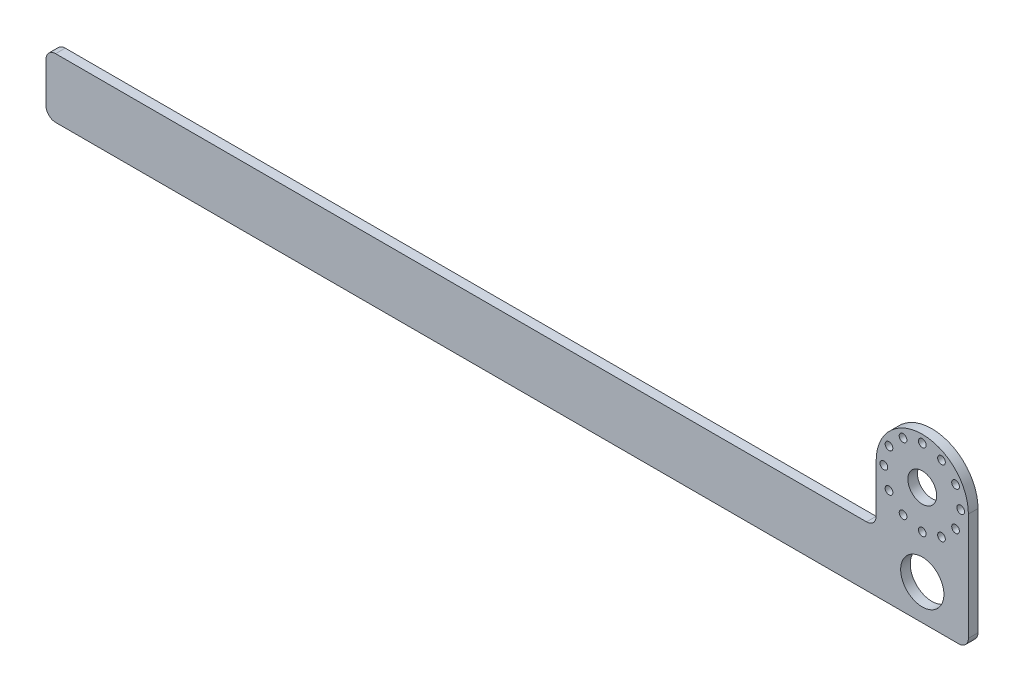
ISO-10303-21;
HEADER;
FILE_DESCRIPTION(('STEP AP214'),'2;1');
FILE_NAME('part.step','',(''),(''),'','','');
FILE_SCHEMA(('AUTOMOTIVE_DESIGN { 1 0 10303 214 1 1 1 1 }'));
ENDSEC;
DATA;
#1=APPLICATION_CONTEXT('core data for automotive mechanical design processes');
#2=APPLICATION_PROTOCOL_DEFINITION('international standard','automotive_design',2000,#1);
#3=PRODUCT_CONTEXT('',#1,'mechanical');
#4=PRODUCT('Part','Part','',(#3));
#5=PRODUCT_RELATED_PRODUCT_CATEGORY('part','',(#4));
#6=PRODUCT_DEFINITION_FORMATION('','',#4);
#7=PRODUCT_DEFINITION_CONTEXT('part definition',#1,'design');
#8=PRODUCT_DEFINITION('design','',#6,#7);
#9=PRODUCT_DEFINITION_SHAPE('','',#8);
#10=(LENGTH_UNIT() NAMED_UNIT(*) SI_UNIT(.MILLI.,.METRE.));
#11=(NAMED_UNIT(*) PLANE_ANGLE_UNIT() SI_UNIT($,.RADIAN.));
#12=(NAMED_UNIT(*) SI_UNIT($,.STERADIAN.) SOLID_ANGLE_UNIT());
#13=UNCERTAINTY_MEASURE_WITH_UNIT(LENGTH_MEASURE(1.E-05),#10,'distance_accuracy_value','');
#14=(GEOMETRIC_REPRESENTATION_CONTEXT(3) GLOBAL_UNCERTAINTY_ASSIGNED_CONTEXT((#13)) GLOBAL_UNIT_ASSIGNED_CONTEXT((#10,
#11,#12)) REPRESENTATION_CONTEXT('',''));
#15=CARTESIAN_POINT('',(0.,0.,0.));
#16=DIRECTION('',(0.,0.,1.));
#17=DIRECTION('',(1.,0.,0.));
#18=AXIS2_PLACEMENT_3D('',#15,#16,#17);
#19=CARTESIAN_POINT('',(609.6,0.,6.35));
#20=DIRECTION('',(1.,0.,0.));
#21=DIRECTION('',(0.,0.,-1.));
#22=AXIS2_PLACEMENT_3D('',#19,#20,#21);
#23=PLANE('',#22);
#24=DIRECTION('',(0.,-1.,0.));
#25=VECTOR('',#24,1.);
#26=CARTESIAN_POINT('',(609.6,0.,6.35));
#27=LINE('',#26,#25);
#28=CARTESIAN_POINT('',(609.6,77.47,6.35));
#29=VERTEX_POINT('',#28);
#30=CARTESIAN_POINT('',(609.6,6.35,6.35));
#31=VERTEX_POINT('',#30);
#32=EDGE_CURVE('E129',#29,#31,#27,.T.);
#33=ORIENTED_EDGE('',*,*,#32,.T.);
#34=DIRECTION('',(0.,0.,-1.));
#35=VECTOR('',#34,1.);
#36=CARTESIAN_POINT('',(609.6,6.35,0.));
#37=LINE('',#36,#35);
#38=CARTESIAN_POINT('',(609.6,6.35,0.));
#39=VERTEX_POINT('',#38);
#40=EDGE_CURVE('E293',#31,#39,#37,.T.);
#41=ORIENTED_EDGE('',*,*,#40,.T.);
#42=DIRECTION('',(0.,-1.,0.));
#43=VECTOR('',#42,1.);
#44=CARTESIAN_POINT('',(609.6,0.,0.));
#45=LINE('',#44,#43);
#46=CARTESIAN_POINT('',(609.6,77.47,0.));
#47=VERTEX_POINT('',#46);
#48=EDGE_CURVE('E132',#47,#39,#45,.T.);
#49=ORIENTED_EDGE('',*,*,#48,.F.);
#50=DIRECTION('',(0.,0.,-1.));
#51=VECTOR('',#50,1.);
#52=CARTESIAN_POINT('',(609.6,77.47,6.35));
#53=LINE('',#52,#51);
#54=EDGE_CURVE('E125',#29,#47,#53,.T.);
#55=ORIENTED_EDGE('',*,*,#54,.F.);
#56=EDGE_LOOP('',(#33,#41,#49,#55));
#57=FACE_BOUND('',#56,.T.);
#58=ADVANCED_FACE('F47',(#57),#23,.T.);
#59=CARTESIAN_POINT('',(579.12,77.47,6.35));
#60=DIRECTION('',(0.,0.,-1.));
#61=DIRECTION('',(-1.,0.,0.));
#62=AXIS2_PLACEMENT_3D('',#59,#60,#61);
#63=CYLINDRICAL_SURFACE('',#62,30.48);
#64=CARTESIAN_POINT('',(579.12,77.47,0.));
#65=DIRECTION('',(0.,0.,1.));
#66=DIRECTION('',(1.,0.,0.));
#67=AXIS2_PLACEMENT_3D('',#64,#65,#66);
#68=CIRCLE('',#67,30.48);
#69=CARTESIAN_POINT('',(548.64,77.47,0.));
#70=VERTEX_POINT('',#69);
#71=EDGE_CURVE('E232',#47,#70,#68,.T.);
#72=ORIENTED_EDGE('',*,*,#71,.T.);
#73=DIRECTION('',(0.,0.,-1.));
#74=VECTOR('',#73,1.);
#75=CARTESIAN_POINT('',(548.64,77.47,6.35));
#76=LINE('',#75,#74);
#77=CARTESIAN_POINT('',(548.64,77.47,6.35));
#78=VERTEX_POINT('',#77);
#79=EDGE_CURVE('E138',#78,#70,#76,.T.);
#80=ORIENTED_EDGE('',*,*,#79,.F.);
#81=CARTESIAN_POINT('',(579.12,77.47,6.35));
#82=DIRECTION('',(0.,0.,1.));
#83=DIRECTION('',(1.,0.,0.));
#84=AXIS2_PLACEMENT_3D('',#81,#82,#83);
#85=CIRCLE('',#84,30.48);
#86=EDGE_CURVE('E142',#29,#78,#85,.T.);
#87=ORIENTED_EDGE('',*,*,#86,.F.);
#88=ORIENTED_EDGE('',*,*,#54,.T.);
#89=EDGE_LOOP('',(#72,#80,#87,#88));
#90=FACE_BOUND('',#89,.T.);
#91=ADVANCED_FACE('F143',(#90),#63,.T.);
#92=CARTESIAN_POINT('',(548.64,0.,6.35));
#93=DIRECTION('',(1.,0.,0.));
#94=DIRECTION('',(0.,0.,-1.));
#95=AXIS2_PLACEMENT_3D('',#92,#93,#94);
#96=PLANE('',#95);
#97=DIRECTION('',(0.,-1.,0.));
#98=VECTOR('',#97,1.);
#99=CARTESIAN_POINT('',(548.64,0.,0.));
#100=LINE('',#99,#98);
#101=CARTESIAN_POINT('',(548.64,45.72,0.));
#102=VERTEX_POINT('',#101);
#103=EDGE_CURVE('E235',#70,#102,#100,.T.);
#104=ORIENTED_EDGE('',*,*,#103,.T.);
#105=DIRECTION('',(0.,0.,-1.));
#106=VECTOR('',#105,1.);
#107=CARTESIAN_POINT('',(548.64,45.72,6.35));
#108=LINE('',#107,#106);
#109=CARTESIAN_POINT('',(548.64,45.72,6.35));
#110=VERTEX_POINT('',#109);
#111=EDGE_CURVE('E290',#102,#110,#108,.F.);
#112=ORIENTED_EDGE('',*,*,#111,.T.);
#113=DIRECTION('',(0.,-1.,0.));
#114=VECTOR('',#113,1.);
#115=CARTESIAN_POINT('',(548.64,0.,6.35));
#116=LINE('',#115,#114);
#117=EDGE_CURVE('E146',#78,#110,#116,.T.);
#118=ORIENTED_EDGE('',*,*,#117,.F.);
#119=ORIENTED_EDGE('',*,*,#79,.T.);
#120=EDGE_LOOP('',(#104,#112,#118,#119));
#121=FACE_BOUND('',#120,.T.);
#122=ADVANCED_FACE('F303',(#121),#96,.F.);
#123=CARTESIAN_POINT('',(0.,39.37,6.35));
#124=DIRECTION('',(0.,1.,0.));
#125=DIRECTION('',(0.,0.,1.));
#126=AXIS2_PLACEMENT_3D('',#123,#124,#125);
#127=PLANE('',#126);
#128=DIRECTION('',(1.,0.,0.));
#129=VECTOR('',#128,1.);
#130=CARTESIAN_POINT('',(0.,39.37,6.35));
#131=LINE('',#130,#129);
#132=CARTESIAN_POINT('',(6.35,39.37,6.35));
#133=VERTEX_POINT('',#132);
#134=CARTESIAN_POINT('',(542.29,39.37,6.35));
#135=VERTEX_POINT('',#134);
#136=EDGE_CURVE('E164',#133,#135,#131,.T.);
#137=ORIENTED_EDGE('',*,*,#136,.T.);
#138=DIRECTION('',(0.,0.,-1.));
#139=VECTOR('',#138,1.);
#140=CARTESIAN_POINT('',(542.29,39.37,6.35));
#141=LINE('',#140,#139);
#142=CARTESIAN_POINT('',(542.29,39.37,0.));
#143=VERTEX_POINT('',#142);
#144=EDGE_CURVE('E286',#135,#143,#141,.T.);
#145=ORIENTED_EDGE('',*,*,#144,.T.);
#146=DIRECTION('',(1.,0.,0.));
#147=VECTOR('',#146,1.);
#148=CARTESIAN_POINT('',(0.,39.37,0.));
#149=LINE('',#148,#147);
#150=CARTESIAN_POINT('',(6.35,39.37,0.));
#151=VERTEX_POINT('',#150);
#152=EDGE_CURVE('E239',#151,#143,#149,.T.);
#153=ORIENTED_EDGE('',*,*,#152,.F.);
#154=DIRECTION('',(0.,0.,-1.));
#155=VECTOR('',#154,1.);
#156=CARTESIAN_POINT('',(6.35,39.37,6.35));
#157=LINE('',#156,#155);
#158=EDGE_CURVE('E68',#151,#133,#157,.F.);
#159=ORIENTED_EDGE('',*,*,#158,.T.);
#160=EDGE_LOOP('',(#137,#145,#153,#159));
#161=FACE_BOUND('',#160,.T.);
#162=ADVANCED_FACE('F305',(#161),#127,.T.);
#163=CARTESIAN_POINT('',(0.,0.,6.35));
#164=DIRECTION('',(-1.,0.,0.));
#165=DIRECTION('',(0.,0.,1.));
#166=AXIS2_PLACEMENT_3D('',#163,#164,#165);
#167=PLANE('',#166);
#168=DIRECTION('',(0.,1.,0.));
#169=VECTOR('',#168,1.);
#170=CARTESIAN_POINT('',(0.,0.,0.));
#171=LINE('',#170,#169);
#172=CARTESIAN_POINT('',(0.,6.35,0.));
#173=VERTEX_POINT('',#172);
#174=CARTESIAN_POINT('',(0.,33.02,0.));
#175=VERTEX_POINT('',#174);
#176=EDGE_CURVE('E243',#173,#175,#171,.T.);
#177=ORIENTED_EDGE('',*,*,#176,.F.);
#178=DIRECTION('',(0.,0.,-1.));
#179=VECTOR('',#178,1.);
#180=CARTESIAN_POINT('',(0.,6.35,6.35));
#181=LINE('',#180,#179);
#182=CARTESIAN_POINT('',(0.,6.35,6.35));
#183=VERTEX_POINT('',#182);
#184=EDGE_CURVE('E273',#173,#183,#181,.F.);
#185=ORIENTED_EDGE('',*,*,#184,.T.);
#186=DIRECTION('',(0.,1.,0.));
#187=VECTOR('',#186,1.);
#188=CARTESIAN_POINT('',(0.,0.,6.35));
#189=LINE('',#188,#187);
#190=CARTESIAN_POINT('',(0.,33.02,6.35));
#191=VERTEX_POINT('',#190);
#192=EDGE_CURVE('E167',#183,#191,#189,.T.);
#193=ORIENTED_EDGE('',*,*,#192,.T.);
#194=DIRECTION('',(0.,0.,-1.));
#195=VECTOR('',#194,1.);
#196=CARTESIAN_POINT('',(0.,33.02,6.35));
#197=LINE('',#196,#195);
#198=EDGE_CURVE('E269',#191,#175,#197,.T.);
#199=ORIENTED_EDGE('',*,*,#198,.T.);
#200=EDGE_LOOP('',(#177,#185,#193,#199));
#201=FACE_BOUND('',#200,.T.);
#202=ADVANCED_FACE('F312',(#201),#167,.T.);
#203=CARTESIAN_POINT('',(566.42,99.4670452561247,6.35));
#204=DIRECTION('',(0.,0.,-1.));
#205=DIRECTION('',(-1.,0.,0.));
#206=AXIS2_PLACEMENT_3D('',#203,#204,#205);
#207=CYLINDRICAL_SURFACE('',#206,2.53999999999995);
#208=CARTESIAN_POINT('',(566.42,99.4670452561247,6.35));
#209=DIRECTION('',(0.,0.,1.));
#210=DIRECTION('',(1.,0.,0.));
#211=AXIS2_PLACEMENT_3D('',#208,#209,#210);
#212=CIRCLE('',#211,2.53999999999995);
#213=CARTESIAN_POINT('',(568.96,99.4670452561247,6.35));
#214=VERTEX_POINT('',#213);
#215=EDGE_CURVE('E154',#214,#214,#212,.T.);
#216=ORIENTED_EDGE('',*,*,#215,.T.);
#217=EDGE_LOOP('',(#216));
#218=FACE_BOUND('',#217,.T.);
#219=CARTESIAN_POINT('',(566.42,99.4670452561247,0.));
#220=DIRECTION('',(0.,0.,1.));
#221=DIRECTION('',(1.,0.,0.));
#222=AXIS2_PLACEMENT_3D('',#219,#220,#221);
#223=CIRCLE('',#222,2.53999999999995);
#224=CARTESIAN_POINT('',(568.96,99.4670452561247,0.));
#225=VERTEX_POINT('',#224);
#226=EDGE_CURVE('E226',#225,#225,#223,.T.);
#227=ORIENTED_EDGE('',*,*,#226,.F.);
#228=EDGE_LOOP('',(#227));
#229=FACE_BOUND('',#228,.T.);
#230=ADVANCED_FACE('F337',(#218,#229),#207,.F.);
#231=CARTESIAN_POINT('',(557.122954743875,90.17,6.35));
#232=DIRECTION('',(0.,0.,-1.));
#233=DIRECTION('',(-1.,0.,0.));
#234=AXIS2_PLACEMENT_3D('',#231,#232,#233);
#235=CYLINDRICAL_SURFACE('',#234,2.53999999999995);
#236=CARTESIAN_POINT('',(557.122954743875,90.17,6.35));
#237=DIRECTION('',(0.,0.,1.));
#238=DIRECTION('',(1.,0.,0.));
#239=AXIS2_PLACEMENT_3D('',#236,#237,#238);
#240=CIRCLE('',#239,2.53999999999995);
#241=CARTESIAN_POINT('',(559.662954743875,90.17,6.35));
#242=VERTEX_POINT('',#241);
#243=EDGE_CURVE('E158',#242,#242,#240,.T.);
#244=ORIENTED_EDGE('',*,*,#243,.T.);
#245=EDGE_LOOP('',(#244));
#246=FACE_BOUND('',#245,.T.);
#247=CARTESIAN_POINT('',(557.122954743875,90.17,0.));
#248=DIRECTION('',(0.,0.,1.));
#249=DIRECTION('',(1.,0.,0.));
#250=AXIS2_PLACEMENT_3D('',#247,#248,#249);
#251=CIRCLE('',#250,2.53999999999995);
#252=CARTESIAN_POINT('',(559.662954743875,90.17,0.));
#253=VERTEX_POINT('',#252);
#254=EDGE_CURVE('E222',#253,#253,#251,.T.);
#255=ORIENTED_EDGE('',*,*,#254,.F.);
#256=EDGE_LOOP('',(#255));
#257=FACE_BOUND('',#256,.T.);
#258=ADVANCED_FACE('F340',(#246,#257),#235,.F.);
#259=CARTESIAN_POINT('',(553.72,77.47,6.35));
#260=DIRECTION('',(0.,0.,-1.));
#261=DIRECTION('',(-1.,0.,0.));
#262=AXIS2_PLACEMENT_3D('',#259,#260,#261);
#263=CYLINDRICAL_SURFACE('',#262,2.53999999999995);
#264=CARTESIAN_POINT('',(553.72,77.47,6.35));
#265=DIRECTION('',(0.,0.,1.));
#266=DIRECTION('',(1.,0.,0.));
#267=AXIS2_PLACEMENT_3D('',#264,#265,#266);
#268=CIRCLE('',#267,2.53999999999995);
#269=CARTESIAN_POINT('',(556.26,77.47,6.35));
#270=VERTEX_POINT('',#269);
#271=EDGE_CURVE('E608',#270,#270,#268,.T.);
#272=ORIENTED_EDGE('',*,*,#271,.T.);
#273=EDGE_LOOP('',(#272));
#274=FACE_BOUND('',#273,.T.);
#275=CARTESIAN_POINT('',(553.72,77.47,0.));
#276=DIRECTION('',(0.,0.,1.));
#277=DIRECTION('',(1.,0.,0.));
#278=AXIS2_PLACEMENT_3D('',#275,#276,#277);
#279=CIRCLE('',#278,2.53999999999995);
#280=CARTESIAN_POINT('',(556.26,77.47,0.));
#281=VERTEX_POINT('',#280);
#282=EDGE_CURVE('E218',#281,#281,#279,.T.);
#283=ORIENTED_EDGE('',*,*,#282,.F.);
#284=EDGE_LOOP('',(#283));
#285=FACE_BOUND('',#284,.T.);
#286=ADVANCED_FACE('F344',(#274,#285),#263,.F.);
#287=CARTESIAN_POINT('',(557.122954743875,64.7699999999999,6.35));
#288=DIRECTION('',(0.,0.,-1.));
#289=DIRECTION('',(-1.,0.,0.));
#290=AXIS2_PLACEMENT_3D('',#287,#288,#289);
#291=CYLINDRICAL_SURFACE('',#290,2.53999999999995);
#292=CARTESIAN_POINT('',(557.122954743875,64.7699999999999,6.35));
#293=DIRECTION('',(0.,0.,1.));
#294=DIRECTION('',(1.,0.,0.));
#295=AXIS2_PLACEMENT_3D('',#292,#293,#294);
#296=CIRCLE('',#295,2.53999999999995);
#297=CARTESIAN_POINT('',(559.662954743875,64.7699999999999,6.35));
#298=VERTEX_POINT('',#297);
#299=EDGE_CURVE('E604',#298,#298,#296,.T.);
#300=ORIENTED_EDGE('',*,*,#299,.T.);
#301=EDGE_LOOP('',(#300));
#302=FACE_BOUND('',#301,.T.);
#303=CARTESIAN_POINT('',(557.122954743875,64.7699999999999,0.));
#304=DIRECTION('',(0.,0.,1.));
#305=DIRECTION('',(1.,0.,0.));
#306=AXIS2_PLACEMENT_3D('',#303,#304,#305);
#307=CIRCLE('',#306,2.53999999999995);
#308=CARTESIAN_POINT('',(559.662954743875,64.7699999999999,0.));
#309=VERTEX_POINT('',#308);
#310=EDGE_CURVE('E214',#309,#309,#307,.T.);
#311=ORIENTED_EDGE('',*,*,#310,.F.);
#312=EDGE_LOOP('',(#311));
#313=FACE_BOUND('',#312,.T.);
#314=ADVANCED_FACE('F348',(#302,#313),#291,.F.);
#315=CARTESIAN_POINT('',(566.42,55.4729547438752,6.35));
#316=DIRECTION('',(0.,0.,-1.));
#317=DIRECTION('',(-1.,0.,0.));
#318=AXIS2_PLACEMENT_3D('',#315,#316,#317);
#319=CYLINDRICAL_SURFACE('',#318,2.54000000000007);
#320=CARTESIAN_POINT('',(566.42,55.4729547438752,6.35));
#321=DIRECTION('',(0.,0.,1.));
#322=DIRECTION('',(1.,0.,0.));
#323=AXIS2_PLACEMENT_3D('',#320,#321,#322);
#324=CIRCLE('',#323,2.54000000000007);
#325=CARTESIAN_POINT('',(568.96,55.4729547438752,6.35));
#326=VERTEX_POINT('',#325);
#327=EDGE_CURVE('E600',#326,#326,#324,.T.);
#328=ORIENTED_EDGE('',*,*,#327,.T.);
#329=EDGE_LOOP('',(#328));
#330=FACE_BOUND('',#329,.T.);
#331=CARTESIAN_POINT('',(566.42,55.4729547438752,0.));
#332=DIRECTION('',(0.,0.,1.));
#333=DIRECTION('',(1.,0.,0.));
#334=AXIS2_PLACEMENT_3D('',#331,#332,#333);
#335=CIRCLE('',#334,2.54000000000007);
#336=CARTESIAN_POINT('',(568.96,55.4729547438752,0.));
#337=VERTEX_POINT('',#336);
#338=EDGE_CURVE('E210',#337,#337,#335,.T.);
#339=ORIENTED_EDGE('',*,*,#338,.F.);
#340=EDGE_LOOP('',(#339));
#341=FACE_BOUND('',#340,.T.);
#342=ADVANCED_FACE('F352',(#330,#341),#319,.F.);
#343=CARTESIAN_POINT('',(579.12,52.07,6.35));
#344=DIRECTION('',(0.,0.,-1.));
#345=DIRECTION('',(-1.,0.,0.));
#346=AXIS2_PLACEMENT_3D('',#343,#344,#345);
#347=CYLINDRICAL_SURFACE('',#346,2.53999999999995);
#348=CARTESIAN_POINT('',(579.12,52.07,6.35));
#349=DIRECTION('',(0.,0.,1.));
#350=DIRECTION('',(1.,0.,0.));
#351=AXIS2_PLACEMENT_3D('',#348,#349,#350);
#352=CIRCLE('',#351,2.53999999999995);
#353=CARTESIAN_POINT('',(581.66,52.07,6.35));
#354=VERTEX_POINT('',#353);
#355=EDGE_CURVE('E596',#354,#354,#352,.T.);
#356=ORIENTED_EDGE('',*,*,#355,.T.);
#357=EDGE_LOOP('',(#356));
#358=FACE_BOUND('',#357,.T.);
#359=CARTESIAN_POINT('',(579.12,52.07,0.));
#360=DIRECTION('',(0.,0.,1.));
#361=DIRECTION('',(1.,0.,0.));
#362=AXIS2_PLACEMENT_3D('',#359,#360,#361);
#363=CIRCLE('',#362,2.53999999999995);
#364=CARTESIAN_POINT('',(581.66,52.07,0.));
#365=VERTEX_POINT('',#364);
#366=EDGE_CURVE('E206',#365,#365,#363,.T.);
#367=ORIENTED_EDGE('',*,*,#366,.F.);
#368=EDGE_LOOP('',(#367));
#369=FACE_BOUND('',#368,.T.);
#370=ADVANCED_FACE('F356',(#358,#369),#347,.F.);
#371=CARTESIAN_POINT('',(591.82,55.4729547438753,6.35));
#372=DIRECTION('',(0.,0.,-1.));
#373=DIRECTION('',(-1.,0.,0.));
#374=AXIS2_PLACEMENT_3D('',#371,#372,#373);
#375=CYLINDRICAL_SURFACE('',#374,2.53999999999995);
#376=CARTESIAN_POINT('',(591.82,55.4729547438753,6.35));
#377=DIRECTION('',(0.,0.,1.));
#378=DIRECTION('',(1.,0.,0.));
#379=AXIS2_PLACEMENT_3D('',#376,#377,#378);
#380=CIRCLE('',#379,2.53999999999995);
#381=CARTESIAN_POINT('',(594.36,55.4729547438753,6.35));
#382=VERTEX_POINT('',#381);
#383=EDGE_CURVE('E592',#382,#382,#380,.T.);
#384=ORIENTED_EDGE('',*,*,#383,.T.);
#385=EDGE_LOOP('',(#384));
#386=FACE_BOUND('',#385,.T.);
#387=CARTESIAN_POINT('',(591.82,55.4729547438753,0.));
#388=DIRECTION('',(0.,0.,1.));
#389=DIRECTION('',(1.,0.,0.));
#390=AXIS2_PLACEMENT_3D('',#387,#388,#389);
#391=CIRCLE('',#390,2.53999999999995);
#392=CARTESIAN_POINT('',(594.36,55.4729547438753,0.));
#393=VERTEX_POINT('',#392);
#394=EDGE_CURVE('E202',#393,#393,#391,.T.);
#395=ORIENTED_EDGE('',*,*,#394,.F.);
#396=EDGE_LOOP('',(#395));
#397=FACE_BOUND('',#396,.T.);
#398=ADVANCED_FACE('F360',(#386,#397),#375,.F.);
#399=CARTESIAN_POINT('',(601.117045256125,64.7700000000001,6.35));
#400=DIRECTION('',(0.,0.,-1.));
#401=DIRECTION('',(-1.,0.,0.));
#402=AXIS2_PLACEMENT_3D('',#399,#400,#401);
#403=CYLINDRICAL_SURFACE('',#402,2.53999999999995);
#404=CARTESIAN_POINT('',(601.117045256125,64.7700000000001,6.35));
#405=DIRECTION('',(0.,0.,1.));
#406=DIRECTION('',(1.,0.,0.));
#407=AXIS2_PLACEMENT_3D('',#404,#405,#406);
#408=CIRCLE('',#407,2.53999999999995);
#409=CARTESIAN_POINT('',(603.657045256125,64.7700000000001,6.35));
#410=VERTEX_POINT('',#409);
#411=EDGE_CURVE('E588',#410,#410,#408,.T.);
#412=ORIENTED_EDGE('',*,*,#411,.T.);
#413=EDGE_LOOP('',(#412));
#414=FACE_BOUND('',#413,.T.);
#415=CARTESIAN_POINT('',(601.117045256125,64.7700000000001,0.));
#416=DIRECTION('',(0.,0.,1.));
#417=DIRECTION('',(1.,0.,0.));
#418=AXIS2_PLACEMENT_3D('',#415,#416,#417);
#419=CIRCLE('',#418,2.53999999999995);
#420=CARTESIAN_POINT('',(603.657045256125,64.7700000000001,0.));
#421=VERTEX_POINT('',#420);
#422=EDGE_CURVE('E198',#421,#421,#419,.T.);
#423=ORIENTED_EDGE('',*,*,#422,.F.);
#424=EDGE_LOOP('',(#423));
#425=FACE_BOUND('',#424,.T.);
#426=ADVANCED_FACE('F364',(#414,#425),#403,.F.);
#427=CARTESIAN_POINT('',(604.52,77.4699999999999,6.35));
#428=DIRECTION('',(0.,0.,-1.));
#429=DIRECTION('',(-1.,0.,0.));
#430=AXIS2_PLACEMENT_3D('',#427,#428,#429);
#431=CYLINDRICAL_SURFACE('',#430,2.53999999999995);
#432=CARTESIAN_POINT('',(604.52,77.4699999999999,6.35));
#433=DIRECTION('',(0.,0.,1.));
#434=DIRECTION('',(1.,0.,0.));
#435=AXIS2_PLACEMENT_3D('',#432,#433,#434);
#436=CIRCLE('',#435,2.53999999999995);
#437=CARTESIAN_POINT('',(607.06,77.4699999999999,6.35));
#438=VERTEX_POINT('',#437);
#439=EDGE_CURVE('E584',#438,#438,#436,.T.);
#440=ORIENTED_EDGE('',*,*,#439,.T.);
#441=EDGE_LOOP('',(#440));
#442=FACE_BOUND('',#441,.T.);
#443=CARTESIAN_POINT('',(604.52,77.4699999999999,0.));
#444=DIRECTION('',(0.,0.,1.));
#445=DIRECTION('',(1.,0.,0.));
#446=AXIS2_PLACEMENT_3D('',#443,#444,#445);
#447=CIRCLE('',#446,2.53999999999995);
#448=CARTESIAN_POINT('',(607.06,77.4699999999999,0.));
#449=VERTEX_POINT('',#448);
#450=EDGE_CURVE('E194',#449,#449,#447,.T.);
#451=ORIENTED_EDGE('',*,*,#450,.F.);
#452=EDGE_LOOP('',(#451));
#453=FACE_BOUND('',#452,.T.);
#454=ADVANCED_FACE('F368',(#442,#453),#431,.F.);
#455=CARTESIAN_POINT('',(601.117045256125,90.17,6.35));
#456=DIRECTION('',(0.,0.,-1.));
#457=DIRECTION('',(-1.,0.,0.));
#458=AXIS2_PLACEMENT_3D('',#455,#456,#457);
#459=CYLINDRICAL_SURFACE('',#458,2.53999999999995);
#460=CARTESIAN_POINT('',(601.117045256125,90.17,6.35));
#461=DIRECTION('',(0.,0.,1.));
#462=DIRECTION('',(1.,0.,0.));
#463=AXIS2_PLACEMENT_3D('',#460,#461,#462);
#464=CIRCLE('',#463,2.53999999999995);
#465=CARTESIAN_POINT('',(603.657045256125,90.17,6.35));
#466=VERTEX_POINT('',#465);
#467=EDGE_CURVE('E580',#466,#466,#464,.T.);
#468=ORIENTED_EDGE('',*,*,#467,.T.);
#469=EDGE_LOOP('',(#468));
#470=FACE_BOUND('',#469,.T.);
#471=CARTESIAN_POINT('',(601.117045256125,90.17,0.));
#472=DIRECTION('',(0.,0.,1.));
#473=DIRECTION('',(1.,0.,0.));
#474=AXIS2_PLACEMENT_3D('',#471,#472,#473);
#475=CIRCLE('',#474,2.53999999999995);
#476=CARTESIAN_POINT('',(603.657045256125,90.17,0.));
#477=VERTEX_POINT('',#476);
#478=EDGE_CURVE('E190',#477,#477,#475,.T.);
#479=ORIENTED_EDGE('',*,*,#478,.F.);
#480=EDGE_LOOP('',(#479));
#481=FACE_BOUND('',#480,.T.);
#482=ADVANCED_FACE('F372',(#470,#481),#459,.F.);
#483=CARTESIAN_POINT('',(591.82,99.4670452561247,6.35));
#484=DIRECTION('',(0.,0.,-1.));
#485=DIRECTION('',(-1.,0.,0.));
#486=AXIS2_PLACEMENT_3D('',#483,#484,#485);
#487=CYLINDRICAL_SURFACE('',#486,2.53999999999995);
#488=CARTESIAN_POINT('',(591.82,99.4670452561247,6.35));
#489=DIRECTION('',(0.,0.,1.));
#490=DIRECTION('',(1.,0.,0.));
#491=AXIS2_PLACEMENT_3D('',#488,#489,#490);
#492=CIRCLE('',#491,2.53999999999995);
#493=CARTESIAN_POINT('',(594.36,99.4670452561247,6.35));
#494=VERTEX_POINT('',#493);
#495=EDGE_CURVE('E576',#494,#494,#492,.T.);
#496=ORIENTED_EDGE('',*,*,#495,.T.);
#497=EDGE_LOOP('',(#496));
#498=FACE_BOUND('',#497,.T.);
#499=CARTESIAN_POINT('',(591.82,99.4670452561247,0.));
#500=DIRECTION('',(0.,0.,1.));
#501=DIRECTION('',(1.,0.,0.));
#502=AXIS2_PLACEMENT_3D('',#499,#500,#501);
#503=CIRCLE('',#502,2.53999999999995);
#504=CARTESIAN_POINT('',(594.36,99.4670452561247,0.));
#505=VERTEX_POINT('',#504);
#506=EDGE_CURVE('E186',#505,#505,#503,.T.);
#507=ORIENTED_EDGE('',*,*,#506,.F.);
#508=EDGE_LOOP('',(#507));
#509=FACE_BOUND('',#508,.T.);
#510=ADVANCED_FACE('F376',(#498,#509),#487,.F.);
#511=CARTESIAN_POINT('',(579.12,102.87,6.35));
#512=DIRECTION('',(0.,0.,-1.));
#513=DIRECTION('',(-1.,0.,0.));
#514=AXIS2_PLACEMENT_3D('',#511,#512,#513);
#515=CYLINDRICAL_SURFACE('',#514,2.54000000000019);
#516=CARTESIAN_POINT('',(579.12,102.87,6.35));
#517=DIRECTION('',(0.,0.,1.));
#518=DIRECTION('',(1.,0.,0.));
#519=AXIS2_PLACEMENT_3D('',#516,#517,#518);
#520=CIRCLE('',#519,2.54000000000019);
#521=CARTESIAN_POINT('',(581.66,102.87,6.35));
#522=VERTEX_POINT('',#521);
#523=EDGE_CURVE('E572',#522,#522,#520,.T.);
#524=ORIENTED_EDGE('',*,*,#523,.T.);
#525=EDGE_LOOP('',(#524));
#526=FACE_BOUND('',#525,.T.);
#527=CARTESIAN_POINT('',(579.12,102.87,0.));
#528=DIRECTION('',(0.,0.,1.));
#529=DIRECTION('',(1.,0.,0.));
#530=AXIS2_PLACEMENT_3D('',#527,#528,#529);
#531=CIRCLE('',#530,2.54000000000019);
#532=CARTESIAN_POINT('',(581.66,102.87,0.));
#533=VERTEX_POINT('',#532);
#534=EDGE_CURVE('E182',#533,#533,#531,.T.);
#535=ORIENTED_EDGE('',*,*,#534,.F.);
#536=EDGE_LOOP('',(#535));
#537=FACE_BOUND('',#536,.T.);
#538=ADVANCED_FACE('F380',(#526,#537),#515,.F.);
#539=CARTESIAN_POINT('',(579.12,77.47,6.35));
#540=DIRECTION('',(0.,0.,-1.));
#541=DIRECTION('',(-1.,0.,0.));
#542=AXIS2_PLACEMENT_3D('',#539,#540,#541);
#543=CYLINDRICAL_SURFACE('',#542,9.52500000000002);
#544=CARTESIAN_POINT('',(579.12,77.47,6.35));
#545=DIRECTION('',(0.,0.,1.));
#546=DIRECTION('',(1.,0.,0.));
#547=AXIS2_PLACEMENT_3D('',#544,#545,#546);
#548=CIRCLE('',#547,9.52500000000002);
#549=CARTESIAN_POINT('',(588.645,77.47,6.35));
#550=VERTEX_POINT('',#549);
#551=EDGE_CURVE('E568',#550,#550,#548,.T.);
#552=ORIENTED_EDGE('',*,*,#551,.T.);
#553=EDGE_LOOP('',(#552));
#554=FACE_BOUND('',#553,.T.);
#555=CARTESIAN_POINT('',(579.12,77.47,0.));
#556=DIRECTION('',(0.,0.,1.));
#557=DIRECTION('',(1.,0.,0.));
#558=AXIS2_PLACEMENT_3D('',#555,#556,#557);
#559=CIRCLE('',#558,9.52500000000002);
#560=CARTESIAN_POINT('',(588.645,77.47,0.));
#561=VERTEX_POINT('',#560);
#562=EDGE_CURVE('E178',#561,#561,#559,.T.);
#563=ORIENTED_EDGE('',*,*,#562,.F.);
#564=EDGE_LOOP('',(#563));
#565=FACE_BOUND('',#564,.T.);
#566=ADVANCED_FACE('F384',(#554,#565),#543,.F.);
#567=CARTESIAN_POINT('',(579.12,23.3786279030496,6.35));
#568=DIRECTION('',(0.,0.,-1.));
#569=DIRECTION('',(-1.,0.,0.));
#570=AXIS2_PLACEMENT_3D('',#567,#568,#569);
#571=CYLINDRICAL_SURFACE('',#570,14.2875);
#572=CARTESIAN_POINT('',(579.12,23.3786279030496,6.35));
#573=DIRECTION('',(0.,0.,1.));
#574=DIRECTION('',(1.,0.,0.));
#575=AXIS2_PLACEMENT_3D('',#572,#573,#574);
#576=CIRCLE('',#575,14.2875);
#577=CARTESIAN_POINT('',(593.4075,23.3786279030496,6.35));
#578=VERTEX_POINT('',#577);
#579=EDGE_CURVE('E251',#578,#578,#576,.T.);
#580=ORIENTED_EDGE('',*,*,#579,.T.);
#581=EDGE_LOOP('',(#580));
#582=FACE_BOUND('',#581,.T.);
#583=CARTESIAN_POINT('',(579.12,23.3786279030496,0.));
#584=DIRECTION('',(0.,0.,1.));
#585=DIRECTION('',(1.,0.,0.));
#586=AXIS2_PLACEMENT_3D('',#583,#584,#585);
#587=CIRCLE('',#586,14.2875);
#588=CARTESIAN_POINT('',(593.4075,23.3786279030496,0.));
#589=VERTEX_POINT('',#588);
#590=EDGE_CURVE('E174',#589,#589,#587,.T.);
#591=ORIENTED_EDGE('',*,*,#590,.F.);
#592=EDGE_LOOP('',(#591));
#593=FACE_BOUND('',#592,.T.);
#594=ADVANCED_FACE('F388',(#582,#593),#571,.F.);
#595=CARTESIAN_POINT('',(0.,0.,6.35));
#596=DIRECTION('',(0.,1.,0.));
#597=DIRECTION('',(0.,0.,1.));
#598=AXIS2_PLACEMENT_3D('',#595,#596,#597);
#599=PLANE('',#598);
#600=DIRECTION('',(1.,0.,0.));
#601=VECTOR('',#600,1.);
#602=CARTESIAN_POINT('',(0.,0.,6.35));
#603=LINE('',#602,#601);
#604=CARTESIAN_POINT('',(6.35,0.,6.35));
#605=VERTEX_POINT('',#604);
#606=CARTESIAN_POINT('',(603.25,0.,6.35));
#607=VERTEX_POINT('',#606);
#608=EDGE_CURVE('E171',#605,#607,#603,.T.);
#609=ORIENTED_EDGE('',*,*,#608,.F.);
#610=DIRECTION('',(0.,0.,-1.));
#611=VECTOR('',#610,1.);
#612=CARTESIAN_POINT('',(6.35,0.,0.));
#613=LINE('',#612,#611);
#614=CARTESIAN_POINT('',(6.35,0.,0.));
#615=VERTEX_POINT('',#614);
#616=EDGE_CURVE('E256',#605,#615,#613,.T.);
#617=ORIENTED_EDGE('',*,*,#616,.T.);
#618=DIRECTION('',(1.,0.,0.));
#619=VECTOR('',#618,1.);
#620=CARTESIAN_POINT('',(0.,0.,0.));
#621=LINE('',#620,#619);
#622=CARTESIAN_POINT('',(603.25,0.,0.));
#623=VERTEX_POINT('',#622);
#624=EDGE_CURVE('E247',#615,#623,#621,.T.);
#625=ORIENTED_EDGE('',*,*,#624,.T.);
#626=DIRECTION('',(0.,0.,-1.));
#627=VECTOR('',#626,1.);
#628=CARTESIAN_POINT('',(603.25,0.,6.35));
#629=LINE('',#628,#627);
#630=EDGE_CURVE('E137',#623,#607,#629,.F.);
#631=ORIENTED_EDGE('',*,*,#630,.T.);
#632=EDGE_LOOP('',(#609,#617,#625,#631));
#633=FACE_BOUND('',#632,.T.);
#634=ADVANCED_FACE('F320',(#633),#599,.F.);
#635=CARTESIAN_POINT('',(0.,0.,6.35));
#636=DIRECTION('',(0.,0.,1.));
#637=DIRECTION('',(1.,0.,0.));
#638=AXIS2_PLACEMENT_3D('',#635,#636,#637);
#639=PLANE('',#638);
#640=ORIENTED_EDGE('',*,*,#579,.F.);
#641=EDGE_LOOP('',(#640));
#642=FACE_BOUND('',#641,.T.);
#643=ORIENTED_EDGE('',*,*,#551,.F.);
#644=EDGE_LOOP('',(#643));
#645=FACE_BOUND('',#644,.T.);
#646=ORIENTED_EDGE('',*,*,#523,.F.);
#647=EDGE_LOOP('',(#646));
#648=FACE_BOUND('',#647,.T.);
#649=ORIENTED_EDGE('',*,*,#495,.F.);
#650=EDGE_LOOP('',(#649));
#651=FACE_BOUND('',#650,.T.);
#652=ORIENTED_EDGE('',*,*,#467,.F.);
#653=EDGE_LOOP('',(#652));
#654=FACE_BOUND('',#653,.T.);
#655=ORIENTED_EDGE('',*,*,#439,.F.);
#656=EDGE_LOOP('',(#655));
#657=FACE_BOUND('',#656,.T.);
#658=ORIENTED_EDGE('',*,*,#411,.F.);
#659=EDGE_LOOP('',(#658));
#660=FACE_BOUND('',#659,.T.);
#661=ORIENTED_EDGE('',*,*,#383,.F.);
#662=EDGE_LOOP('',(#661));
#663=FACE_BOUND('',#662,.T.);
#664=ORIENTED_EDGE('',*,*,#355,.F.);
#665=EDGE_LOOP('',(#664));
#666=FACE_BOUND('',#665,.T.);
#667=ORIENTED_EDGE('',*,*,#327,.F.);
#668=EDGE_LOOP('',(#667));
#669=FACE_BOUND('',#668,.T.);
#670=ORIENTED_EDGE('',*,*,#299,.F.);
#671=EDGE_LOOP('',(#670));
#672=FACE_BOUND('',#671,.T.);
#673=ORIENTED_EDGE('',*,*,#271,.F.);
#674=EDGE_LOOP('',(#673));
#675=FACE_BOUND('',#674,.T.);
#676=ORIENTED_EDGE('',*,*,#243,.F.);
#677=EDGE_LOOP('',(#676));
#678=FACE_BOUND('',#677,.T.);
#679=ORIENTED_EDGE('',*,*,#215,.F.);
#680=EDGE_LOOP('',(#679));
#681=FACE_BOUND('',#680,.T.);
#682=ORIENTED_EDGE('',*,*,#192,.F.);
#683=CARTESIAN_POINT('',(6.35,6.35,6.35));
#684=DIRECTION('',(0.,0.,1.));
#685=DIRECTION('',(1.,0.,0.));
#686=AXIS2_PLACEMENT_3D('',#683,#684,#685);
#687=CIRCLE('',#686,6.35);
#688=EDGE_CURVE('E281',#183,#605,#687,.T.);
#689=ORIENTED_EDGE('',*,*,#688,.T.);
#690=ORIENTED_EDGE('',*,*,#608,.T.);
#691=CARTESIAN_POINT('',(603.25,6.35,6.35));
#692=DIRECTION('',(0.,0.,1.));
#693=DIRECTION('',(1.,0.,0.));
#694=AXIS2_PLACEMENT_3D('',#691,#692,#693);
#695=CIRCLE('',#694,6.35);
#696=EDGE_CURVE('E152',#607,#31,#695,.T.);
#697=ORIENTED_EDGE('',*,*,#696,.T.);
#698=ORIENTED_EDGE('',*,*,#32,.F.);
#699=ORIENTED_EDGE('',*,*,#86,.T.);
#700=ORIENTED_EDGE('',*,*,#117,.T.);
#701=CARTESIAN_POINT('',(542.29,45.72,6.35));
#702=DIRECTION('',(0.,0.,1.));
#703=DIRECTION('',(1.,0.,0.));
#704=AXIS2_PLACEMENT_3D('',#701,#702,#703);
#705=CIRCLE('',#704,6.35);
#706=EDGE_CURVE('E11',#110,#135,#705,.F.);
#707=ORIENTED_EDGE('',*,*,#706,.T.);
#708=ORIENTED_EDGE('',*,*,#136,.F.);
#709=CARTESIAN_POINT('',(6.35,33.02,6.35));
#710=DIRECTION('',(0.,0.,1.));
#711=DIRECTION('',(1.,0.,0.));
#712=AXIS2_PLACEMENT_3D('',#709,#710,#711);
#713=CIRCLE('',#712,6.35);
#714=EDGE_CURVE('E278',#133,#191,#713,.T.);
#715=ORIENTED_EDGE('',*,*,#714,.T.);
#716=EDGE_LOOP('',(#682,#689,#690,#697,#698,#699,#700,#707,#708,#715));
#717=FACE_BOUND('',#716,.T.);
#718=ADVANCED_FACE('F149',(#642,#645,#648,#651,#654,#657,#660,#663,#666,#669,#672,#675,#678,
#681,#717),#639,.T.);
#719=CARTESIAN_POINT('',(0.,0.,0.));
#720=DIRECTION('',(0.,0.,1.));
#721=DIRECTION('',(1.,0.,0.));
#722=AXIS2_PLACEMENT_3D('',#719,#720,#721);
#723=PLANE('',#722);
#724=ORIENTED_EDGE('',*,*,#590,.T.);
#725=EDGE_LOOP('',(#724));
#726=FACE_BOUND('',#725,.T.);
#727=ORIENTED_EDGE('',*,*,#562,.T.);
#728=EDGE_LOOP('',(#727));
#729=FACE_BOUND('',#728,.T.);
#730=ORIENTED_EDGE('',*,*,#534,.T.);
#731=EDGE_LOOP('',(#730));
#732=FACE_BOUND('',#731,.T.);
#733=ORIENTED_EDGE('',*,*,#506,.T.);
#734=EDGE_LOOP('',(#733));
#735=FACE_BOUND('',#734,.T.);
#736=ORIENTED_EDGE('',*,*,#478,.T.);
#737=EDGE_LOOP('',(#736));
#738=FACE_BOUND('',#737,.T.);
#739=ORIENTED_EDGE('',*,*,#450,.T.);
#740=EDGE_LOOP('',(#739));
#741=FACE_BOUND('',#740,.T.);
#742=ORIENTED_EDGE('',*,*,#422,.T.);
#743=EDGE_LOOP('',(#742));
#744=FACE_BOUND('',#743,.T.);
#745=ORIENTED_EDGE('',*,*,#394,.T.);
#746=EDGE_LOOP('',(#745));
#747=FACE_BOUND('',#746,.T.);
#748=ORIENTED_EDGE('',*,*,#366,.T.);
#749=EDGE_LOOP('',(#748));
#750=FACE_BOUND('',#749,.T.);
#751=ORIENTED_EDGE('',*,*,#338,.T.);
#752=EDGE_LOOP('',(#751));
#753=FACE_BOUND('',#752,.T.);
#754=ORIENTED_EDGE('',*,*,#310,.T.);
#755=EDGE_LOOP('',(#754));
#756=FACE_BOUND('',#755,.T.);
#757=ORIENTED_EDGE('',*,*,#282,.T.);
#758=EDGE_LOOP('',(#757));
#759=FACE_BOUND('',#758,.T.);
#760=ORIENTED_EDGE('',*,*,#254,.T.);
#761=EDGE_LOOP('',(#760));
#762=FACE_BOUND('',#761,.T.);
#763=ORIENTED_EDGE('',*,*,#226,.T.);
#764=EDGE_LOOP('',(#763));
#765=FACE_BOUND('',#764,.T.);
#766=ORIENTED_EDGE('',*,*,#624,.F.);
#767=CARTESIAN_POINT('',(6.35,6.35,0.));
#768=DIRECTION('',(0.,0.,1.));
#769=DIRECTION('',(1.,0.,0.));
#770=AXIS2_PLACEMENT_3D('',#767,#768,#769);
#771=CIRCLE('',#770,6.35);
#772=EDGE_CURVE('E266',#615,#173,#771,.F.);
#773=ORIENTED_EDGE('',*,*,#772,.T.);
#774=ORIENTED_EDGE('',*,*,#176,.T.);
#775=CARTESIAN_POINT('',(6.35,33.02,0.));
#776=DIRECTION('',(0.,0.,1.));
#777=DIRECTION('',(1.,0.,0.));
#778=AXIS2_PLACEMENT_3D('',#775,#776,#777);
#779=CIRCLE('',#778,6.35);
#780=EDGE_CURVE('E263',#175,#151,#779,.F.);
#781=ORIENTED_EDGE('',*,*,#780,.T.);
#782=ORIENTED_EDGE('',*,*,#152,.T.);
#783=CARTESIAN_POINT('',(542.29,45.72,0.));
#784=DIRECTION('',(0.,0.,1.));
#785=DIRECTION('',(1.,0.,0.));
#786=AXIS2_PLACEMENT_3D('',#783,#784,#785);
#787=CIRCLE('',#786,6.35);
#788=EDGE_CURVE('E56',#143,#102,#787,.T.);
#789=ORIENTED_EDGE('',*,*,#788,.T.);
#790=ORIENTED_EDGE('',*,*,#103,.F.);
#791=ORIENTED_EDGE('',*,*,#71,.F.);
#792=ORIENTED_EDGE('',*,*,#48,.T.);
#793=CARTESIAN_POINT('',(603.25,6.35,0.));
#794=DIRECTION('',(0.,0.,1.));
#795=DIRECTION('',(1.,0.,0.));
#796=AXIS2_PLACEMENT_3D('',#793,#794,#795);
#797=CIRCLE('',#796,6.35);
#798=EDGE_CURVE('E260',#39,#623,#797,.F.);
#799=ORIENTED_EDGE('',*,*,#798,.T.);
#800=EDGE_LOOP('',(#766,#773,#774,#781,#782,#789,#790,#791,#792,#799));
#801=FACE_BOUND('',#800,.T.);
#802=ADVANCED_FACE('F298',(#726,#729,#732,#735,#738,#741,#744,#747,#750,#753,#756,#759,#762,
#765,#801),#723,.F.);
#803=CARTESIAN_POINT('',(6.35,6.35,6.35));
#804=DIRECTION('',(0.,0.,1.));
#805=DIRECTION('',(1.,0.,0.));
#806=AXIS2_PLACEMENT_3D('',#803,#804,#805);
#807=CYLINDRICAL_SURFACE('',#806,6.35);
#808=ORIENTED_EDGE('',*,*,#688,.F.);
#809=ORIENTED_EDGE('',*,*,#184,.F.);
#810=ORIENTED_EDGE('',*,*,#772,.F.);
#811=ORIENTED_EDGE('',*,*,#616,.F.);
#812=EDGE_LOOP('',(#808,#809,#810,#811));
#813=FACE_BOUND('',#812,.T.);
#814=ADVANCED_FACE('F317',(#813),#807,.T.);
#815=CARTESIAN_POINT('',(542.29,45.72,6.35));
#816=DIRECTION('',(0.,0.,-1.));
#817=DIRECTION('',(-1.,0.,0.));
#818=AXIS2_PLACEMENT_3D('',#815,#816,#817);
#819=CYLINDRICAL_SURFACE('',#818,6.35);
#820=ORIENTED_EDGE('',*,*,#706,.F.);
#821=ORIENTED_EDGE('',*,*,#111,.F.);
#822=ORIENTED_EDGE('',*,*,#788,.F.);
#823=ORIENTED_EDGE('',*,*,#144,.F.);
#824=EDGE_LOOP('',(#820,#821,#822,#823));
#825=FACE_BOUND('',#824,.T.);
#826=ADVANCED_FACE('F304',(#825),#819,.F.);
#827=CARTESIAN_POINT('',(6.35,33.02,6.35));
#828=DIRECTION('',(0.,0.,-1.));
#829=DIRECTION('',(-1.,0.,0.));
#830=AXIS2_PLACEMENT_3D('',#827,#828,#829);
#831=CYLINDRICAL_SURFACE('',#830,6.35);
#832=ORIENTED_EDGE('',*,*,#714,.F.);
#833=ORIENTED_EDGE('',*,*,#158,.F.);
#834=ORIENTED_EDGE('',*,*,#780,.F.);
#835=ORIENTED_EDGE('',*,*,#198,.F.);
#836=EDGE_LOOP('',(#832,#833,#834,#835));
#837=FACE_BOUND('',#836,.T.);
#838=ADVANCED_FACE('F309',(#837),#831,.T.);
#839=CARTESIAN_POINT('',(603.25,6.35,6.35));
#840=DIRECTION('',(0.,0.,1.));
#841=DIRECTION('',(1.,0.,0.));
#842=AXIS2_PLACEMENT_3D('',#839,#840,#841);
#843=CYLINDRICAL_SURFACE('',#842,6.35);
#844=ORIENTED_EDGE('',*,*,#696,.F.);
#845=ORIENTED_EDGE('',*,*,#630,.F.);
#846=ORIENTED_EDGE('',*,*,#798,.F.);
#847=ORIENTED_EDGE('',*,*,#40,.F.);
#848=EDGE_LOOP('',(#844,#845,#846,#847));
#849=FACE_BOUND('',#848,.T.);
#850=ADVANCED_FACE('F49',(#849),#843,.T.);
#851=CLOSED_SHELL('',(#58,#91,#122,#162,#202,#230,#258,#286,#314,#342,#370,#398,#426,#454,#482,
#510,#538,#566,#594,#634,#718,#802,#814,#826,#838,#850));
#852=MANIFOLD_SOLID_BREP('B2',#851);
#853=ADVANCED_BREP_SHAPE_REPRESENTATION('',(#18,#852),#14);
#854=SHAPE_DEFINITION_REPRESENTATION(#9,#853);
ENDSEC;
END-ISO-10303-21;
